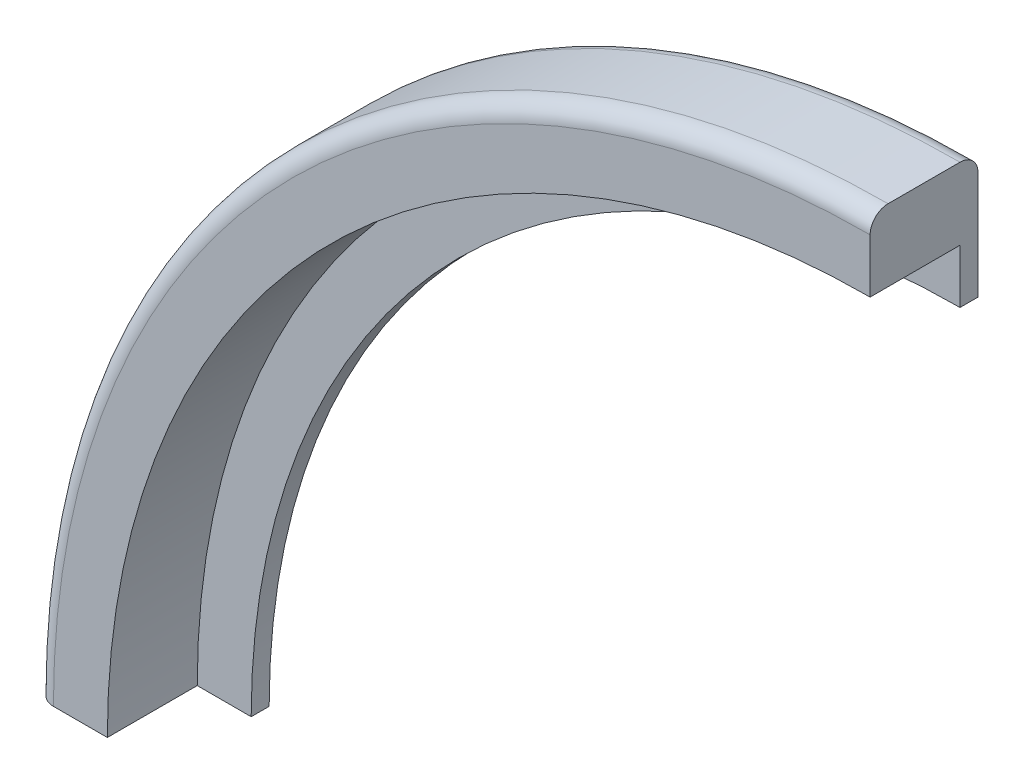
ISO-10303-21;
HEADER;
FILE_DESCRIPTION(('STEP AP214'),'2;1');
FILE_NAME('part.step','',(''),(''),'','','');
FILE_SCHEMA(('AUTOMOTIVE_DESIGN { 1 0 10303 214 1 1 1 1 }'));
ENDSEC;
DATA;
#1=APPLICATION_CONTEXT('core data for automotive mechanical design processes');
#2=APPLICATION_PROTOCOL_DEFINITION('international standard','automotive_design',2000,#1);
#3=PRODUCT_CONTEXT('',#1,'mechanical');
#4=PRODUCT('Part','Part','',(#3));
#5=PRODUCT_RELATED_PRODUCT_CATEGORY('part','',(#4));
#6=PRODUCT_DEFINITION_FORMATION('','',#4);
#7=PRODUCT_DEFINITION_CONTEXT('part definition',#1,'design');
#8=PRODUCT_DEFINITION('design','',#6,#7);
#9=PRODUCT_DEFINITION_SHAPE('','',#8);
#10=(LENGTH_UNIT() NAMED_UNIT(*) SI_UNIT(.MILLI.,.METRE.));
#11=(NAMED_UNIT(*) PLANE_ANGLE_UNIT() SI_UNIT($,.RADIAN.));
#12=(NAMED_UNIT(*) SI_UNIT($,.STERADIAN.) SOLID_ANGLE_UNIT());
#13=UNCERTAINTY_MEASURE_WITH_UNIT(LENGTH_MEASURE(1.E-05),#10,'distance_accuracy_value','');
#14=(GEOMETRIC_REPRESENTATION_CONTEXT(3) GLOBAL_UNCERTAINTY_ASSIGNED_CONTEXT((#13)) GLOBAL_UNIT_ASSIGNED_CONTEXT((#10,
#11,#12)) REPRESENTATION_CONTEXT('',''));
#15=CARTESIAN_POINT('',(0.,0.,0.));
#16=DIRECTION('',(0.,0.,1.));
#17=DIRECTION('',(1.,0.,0.));
#18=AXIS2_PLACEMENT_3D('',#15,#16,#17);
#19=CARTESIAN_POINT('',(-25.,-17.4264068711928,2.5));
#20=DIRECTION('',(0.,-1.,0.));
#21=DIRECTION('',(0.,0.,1.));
#22=AXIS2_PLACEMENT_3D('',#19,#20,#21);
#23=PLANE('',#22);
#24=DIRECTION('',(-1.,0.,0.));
#25=VECTOR('',#24,1.);
#26=CARTESIAN_POINT('',(-25.,-17.4264068711928,5.));
#27=LINE('',#26,#25);
#28=CARTESIAN_POINT('',(-25.,-17.4264068711928,5.));
#29=VERTEX_POINT('',#28);
#30=CARTESIAN_POINT('',(-28.,-17.4264068711928,5.));
#31=VERTEX_POINT('',#30);
#32=EDGE_CURVE('E152',#29,#31,#27,.T.);
#33=ORIENTED_EDGE('',*,*,#32,.T.);
#34=CARTESIAN_POINT('',(-28.,-17.4264068711928,4.));
#35=DIRECTION('',(0.,-1.,0.));
#36=DIRECTION('',(1.,0.,0.));
#37=AXIS2_PLACEMENT_3D('',#34,#35,#36);
#38=CIRCLE('',#37,1.);
#39=CARTESIAN_POINT('',(-29.,-17.4264068711928,4.));
#40=VERTEX_POINT('',#39);
#41=EDGE_CURVE('E162',#31,#40,#38,.T.);
#42=ORIENTED_EDGE('',*,*,#41,.T.);
#43=DIRECTION('',(0.,0.,1.));
#44=VECTOR('',#43,1.);
#45=CARTESIAN_POINT('',(-29.,-17.4264068711928,0.));
#46=LINE('',#45,#44);
#47=CARTESIAN_POINT('',(-29.,-17.4264068711928,0.));
#48=VERTEX_POINT('',#47);
#49=EDGE_CURVE('E136',#48,#40,#46,.T.);
#50=ORIENTED_EDGE('',*,*,#49,.F.);
#51=CARTESIAN_POINT('',(-28.,-17.4264068711928,0.));
#52=DIRECTION('',(0.,-1.,0.));
#53=DIRECTION('',(1.,0.,0.));
#54=AXIS2_PLACEMENT_3D('',#51,#52,#53);
#55=CIRCLE('',#54,1.);
#56=CARTESIAN_POINT('',(-28.,-17.4264068711928,-1.));
#57=VERTEX_POINT('',#56);
#58=EDGE_CURVE('E160',#48,#57,#55,.T.);
#59=ORIENTED_EDGE('',*,*,#58,.T.);
#60=DIRECTION('',(-1.,0.,0.));
#61=VECTOR('',#60,1.);
#62=CARTESIAN_POINT('',(-22.,-17.4264068711928,-1.));
#63=LINE('',#62,#61);
#64=CARTESIAN_POINT('',(-22.,-17.4264068711928,-1.));
#65=VERTEX_POINT('',#64);
#66=EDGE_CURVE('E126',#65,#57,#63,.T.);
#67=ORIENTED_EDGE('',*,*,#66,.F.);
#68=DIRECTION('',(0.,0.,1.));
#69=VECTOR('',#68,1.);
#70=CARTESIAN_POINT('',(-22.,-17.4264068711928,-1.));
#71=LINE('',#70,#69);
#72=CARTESIAN_POINT('',(-22.,-17.4264068711928,0.));
#73=VERTEX_POINT('',#72);
#74=EDGE_CURVE('E121',#65,#73,#71,.T.);
#75=ORIENTED_EDGE('',*,*,#74,.T.);
#76=DIRECTION('',(-1.,0.,0.));
#77=VECTOR('',#76,1.);
#78=CARTESIAN_POINT('',(-25.,-17.4264068711928,0.));
#79=LINE('',#78,#77);
#80=CARTESIAN_POINT('',(-25.,-17.4264068711928,0.));
#81=VERTEX_POINT('',#80);
#82=EDGE_CURVE('E109',#73,#81,#79,.T.);
#83=ORIENTED_EDGE('',*,*,#82,.T.);
#84=DIRECTION('',(0.,0.,1.));
#85=VECTOR('',#84,1.);
#86=CARTESIAN_POINT('',(-25.,-17.4264068711928,0.));
#87=LINE('',#86,#85);
#88=EDGE_CURVE('E141',#81,#29,#87,.T.);
#89=ORIENTED_EDGE('',*,*,#88,.T.);
#90=EDGE_LOOP('',(#33,#42,#50,#59,#67,#75,#83,#89));
#91=FACE_BOUND('',#90,.T.);
#92=ADVANCED_FACE('F35',(#91),#23,.T.);
#93=CARTESIAN_POINT('',(17.4264068711928,-17.4264068711928,5.));
#94=DIRECTION('',(0.,0.,-1.));
#95=DIRECTION('',(-1.,0.,0.));
#96=AXIS2_PLACEMENT_3D('',#93,#94,#95);
#97=PLANE('',#96);
#98=DIRECTION('',(0.,1.,0.));
#99=VECTOR('',#98,1.);
#100=CARTESIAN_POINT('',(17.4264068711928,25.,5.));
#101=LINE('',#100,#99);
#102=CARTESIAN_POINT('',(17.4264068711928,25.,5.));
#103=VERTEX_POINT('',#102);
#104=CARTESIAN_POINT('',(17.4264068711928,28.,5.));
#105=VERTEX_POINT('',#104);
#106=EDGE_CURVE('E138',#103,#105,#101,.T.);
#107=ORIENTED_EDGE('',*,*,#106,.T.);
#108=CARTESIAN_POINT('',(17.4264068711928,-17.4264068711928,5.));
#109=DIRECTION('',(0.,0.,-1.));
#110=DIRECTION('',(-1.,0.,0.));
#111=AXIS2_PLACEMENT_3D('',#108,#109,#110);
#112=CIRCLE('',#111,45.4264068711928);
#113=EDGE_CURVE('E155',#105,#31,#112,.F.);
#114=ORIENTED_EDGE('',*,*,#113,.T.);
#115=ORIENTED_EDGE('',*,*,#32,.F.);
#116=CARTESIAN_POINT('',(17.4264068711928,-17.4264068711928,5.));
#117=DIRECTION('',(0.,0.,1.));
#118=DIRECTION('',(1.,0.,0.));
#119=AXIS2_PLACEMENT_3D('',#116,#117,#118);
#120=CIRCLE('',#119,42.4264068711928);
#121=EDGE_CURVE('E120',#103,#29,#120,.T.);
#122=ORIENTED_EDGE('',*,*,#121,.F.);
#123=EDGE_LOOP('',(#107,#114,#115,#122));
#124=FACE_BOUND('',#123,.T.);
#125=ADVANCED_FACE('F172',(#124),#97,.F.);
#126=CARTESIAN_POINT('',(17.4264068711928,25.,2.5));
#127=DIRECTION('',(-1.,0.,0.));
#128=DIRECTION('',(0.,0.,1.));
#129=AXIS2_PLACEMENT_3D('',#126,#127,#128);
#130=PLANE('',#129);
#131=DIRECTION('',(0.,0.,1.));
#132=VECTOR('',#131,1.);
#133=CARTESIAN_POINT('',(17.4264068711928,29.,0.));
#134=LINE('',#133,#132);
#135=CARTESIAN_POINT('',(17.4264068711928,29.,0.));
#136=VERTEX_POINT('',#135);
#137=CARTESIAN_POINT('',(17.4264068711928,29.,4.));
#138=VERTEX_POINT('',#137);
#139=EDGE_CURVE('E139',#136,#138,#134,.T.);
#140=ORIENTED_EDGE('',*,*,#139,.T.);
#141=CARTESIAN_POINT('',(17.4264068711928,28.,4.));
#142=DIRECTION('',(-1.,0.,0.));
#143=DIRECTION('',(0.,-1.,0.));
#144=AXIS2_PLACEMENT_3D('',#141,#142,#143);
#145=CIRCLE('',#144,1.);
#146=EDGE_CURVE('E43',#138,#105,#145,.F.);
#147=ORIENTED_EDGE('',*,*,#146,.T.);
#148=ORIENTED_EDGE('',*,*,#106,.F.);
#149=DIRECTION('',(0.,0.,1.));
#150=VECTOR('',#149,1.);
#151=CARTESIAN_POINT('',(17.4264068711928,25.,0.));
#152=LINE('',#151,#150);
#153=CARTESIAN_POINT('',(17.4264068711928,25.,0.));
#154=VERTEX_POINT('',#153);
#155=EDGE_CURVE('E145',#154,#103,#152,.T.);
#156=ORIENTED_EDGE('',*,*,#155,.F.);
#157=DIRECTION('',(0.,-1.,0.));
#158=VECTOR('',#157,1.);
#159=CARTESIAN_POINT('',(17.4264068711928,29.,0.));
#160=LINE('',#159,#158);
#161=CARTESIAN_POINT('',(17.4264068711929,22.,0.));
#162=VERTEX_POINT('',#161);
#163=EDGE_CURVE('E116',#154,#162,#160,.T.);
#164=ORIENTED_EDGE('',*,*,#163,.T.);
#165=DIRECTION('',(0.,0.,1.));
#166=VECTOR('',#165,1.);
#167=CARTESIAN_POINT('',(17.4264068711929,22.,-1.));
#168=LINE('',#167,#166);
#169=CARTESIAN_POINT('',(17.4264068711929,22.,-1.));
#170=VERTEX_POINT('',#169);
#171=EDGE_CURVE('E112',#170,#162,#168,.T.);
#172=ORIENTED_EDGE('',*,*,#171,.F.);
#173=DIRECTION('',(0.,-1.,0.));
#174=VECTOR('',#173,1.);
#175=CARTESIAN_POINT('',(17.4264068711928,29.,-1.));
#176=LINE('',#175,#174);
#177=CARTESIAN_POINT('',(17.4264068711928,28.,-1.));
#178=VERTEX_POINT('',#177);
#179=EDGE_CURVE('E101',#178,#170,#176,.T.);
#180=ORIENTED_EDGE('',*,*,#179,.F.);
#181=CARTESIAN_POINT('',(17.4264068711928,28.,0.));
#182=DIRECTION('',(-1.,0.,0.));
#183=DIRECTION('',(0.,-1.,0.));
#184=AXIS2_PLACEMENT_3D('',#181,#182,#183);
#185=CIRCLE('',#184,1.);
#186=EDGE_CURVE('E50',#178,#136,#185,.F.);
#187=ORIENTED_EDGE('',*,*,#186,.T.);
#188=EDGE_LOOP('',(#140,#147,#148,#156,#164,#172,#180,#187));
#189=FACE_BOUND('',#188,.T.);
#190=ADVANCED_FACE('F113',(#189),#130,.F.);
#191=CARTESIAN_POINT('',(17.4264068711928,-17.4264068711928,0.));
#192=DIRECTION('',(0.,0.,1.));
#193=DIRECTION('',(1.,0.,0.));
#194=AXIS2_PLACEMENT_3D('',#191,#192,#193);
#195=CYLINDRICAL_SURFACE('',#194,46.4264068711928);
#196=ORIENTED_EDGE('',*,*,#49,.T.);
#197=CARTESIAN_POINT('',(17.4264068711928,-17.4264068711928,4.));
#198=DIRECTION('',(0.,0.,-1.));
#199=DIRECTION('',(-1.,0.,0.));
#200=AXIS2_PLACEMENT_3D('',#197,#198,#199);
#201=CIRCLE('',#200,46.4264068711928);
#202=EDGE_CURVE('E57',#40,#138,#201,.T.);
#203=ORIENTED_EDGE('',*,*,#202,.T.);
#204=ORIENTED_EDGE('',*,*,#139,.F.);
#205=CARTESIAN_POINT('',(17.4264068711928,-17.4264068711928,0.));
#206=DIRECTION('',(0.,0.,-1.));
#207=DIRECTION('',(-1.,0.,0.));
#208=AXIS2_PLACEMENT_3D('',#205,#206,#207);
#209=CIRCLE('',#208,46.4264068711928);
#210=EDGE_CURVE('E164',#136,#48,#209,.F.);
#211=ORIENTED_EDGE('',*,*,#210,.T.);
#212=EDGE_LOOP('',(#196,#203,#204,#211));
#213=FACE_BOUND('',#212,.T.);
#214=ADVANCED_FACE('F177',(#213),#195,.T.);
#215=CARTESIAN_POINT('',(17.4264068711928,-17.4264068711928,0.));
#216=DIRECTION('',(0.,0.,1.));
#217=DIRECTION('',(1.,0.,0.));
#218=AXIS2_PLACEMENT_3D('',#215,#216,#217);
#219=CYLINDRICAL_SURFACE('',#218,42.4264068711928);
#220=ORIENTED_EDGE('',*,*,#121,.T.);
#221=ORIENTED_EDGE('',*,*,#88,.F.);
#222=CARTESIAN_POINT('',(17.4264068711928,-17.4264068711928,0.));
#223=DIRECTION('',(0.,0.,1.));
#224=DIRECTION('',(1.,0.,0.));
#225=AXIS2_PLACEMENT_3D('',#222,#223,#224);
#226=CIRCLE('',#225,42.4264068711928);
#227=EDGE_CURVE('E142',#154,#81,#226,.T.);
#228=ORIENTED_EDGE('',*,*,#227,.F.);
#229=ORIENTED_EDGE('',*,*,#155,.T.);
#230=EDGE_LOOP('',(#220,#221,#228,#229));
#231=FACE_BOUND('',#230,.T.);
#232=ADVANCED_FACE('F181',(#231),#219,.F.);
#233=CARTESIAN_POINT('',(17.4264068711928,-17.4264068711928,0.));
#234=DIRECTION('',(0.,0.,-1.));
#235=DIRECTION('',(-1.,0.,0.));
#236=AXIS2_PLACEMENT_3D('',#233,#234,#235);
#237=PLANE('',#236);
#238=ORIENTED_EDGE('',*,*,#163,.F.);
#239=ORIENTED_EDGE('',*,*,#227,.T.);
#240=ORIENTED_EDGE('',*,*,#82,.F.);
#241=CARTESIAN_POINT('',(17.4264068711928,-17.4264068711928,0.));
#242=DIRECTION('',(0.,0.,1.));
#243=DIRECTION('',(-1.,0.,0.));
#244=AXIS2_PLACEMENT_3D('',#241,#242,#243);
#245=CIRCLE('',#244,39.4264068711928);
#246=EDGE_CURVE('E131',#162,#73,#245,.T.);
#247=ORIENTED_EDGE('',*,*,#246,.F.);
#248=EDGE_LOOP('',(#238,#239,#240,#247));
#249=FACE_BOUND('',#248,.T.);
#250=ADVANCED_FACE('F179',(#249),#237,.F.);
#251=CARTESIAN_POINT('',(17.4264068711928,-17.4264068711928,-1.));
#252=DIRECTION('',(0.,0.,1.));
#253=DIRECTION('',(1.,0.,0.));
#254=AXIS2_PLACEMENT_3D('',#251,#252,#253);
#255=CYLINDRICAL_SURFACE('',#254,39.4264068711928);
#256=ORIENTED_EDGE('',*,*,#246,.T.);
#257=ORIENTED_EDGE('',*,*,#74,.F.);
#258=CARTESIAN_POINT('',(17.4264068711928,-17.4264068711928,-1.));
#259=DIRECTION('',(0.,0.,1.));
#260=DIRECTION('',(-1.,0.,0.));
#261=AXIS2_PLACEMENT_3D('',#258,#259,#260);
#262=CIRCLE('',#261,39.4264068711928);
#263=EDGE_CURVE('E106',#170,#65,#262,.T.);
#264=ORIENTED_EDGE('',*,*,#263,.F.);
#265=ORIENTED_EDGE('',*,*,#171,.T.);
#266=EDGE_LOOP('',(#256,#257,#264,#265));
#267=FACE_BOUND('',#266,.T.);
#268=ADVANCED_FACE('F123',(#267),#255,.F.);
#269=CARTESIAN_POINT('',(17.4264068711928,-17.4264068711928,-1.));
#270=DIRECTION('',(0.,0.,-1.));
#271=DIRECTION('',(-1.,0.,0.));
#272=AXIS2_PLACEMENT_3D('',#269,#270,#271);
#273=PLANE('',#272);
#274=ORIENTED_EDGE('',*,*,#66,.T.);
#275=CARTESIAN_POINT('',(17.4264068711928,-17.4264068711928,-1.));
#276=DIRECTION('',(0.,0.,-1.));
#277=DIRECTION('',(-1.,0.,0.));
#278=AXIS2_PLACEMENT_3D('',#275,#276,#277);
#279=CIRCLE('',#278,45.4264068711928);
#280=EDGE_CURVE('E11',#57,#178,#279,.T.);
#281=ORIENTED_EDGE('',*,*,#280,.T.);
#282=ORIENTED_EDGE('',*,*,#179,.T.);
#283=ORIENTED_EDGE('',*,*,#263,.T.);
#284=EDGE_LOOP('',(#274,#281,#282,#283));
#285=FACE_BOUND('',#284,.T.);
#286=ADVANCED_FACE('F104',(#285),#273,.T.);
#287=CARTESIAN_POINT('',(17.4264068711928,-17.4264068711928,4.));
#288=DIRECTION('',(0.,0.,-1.));
#289=DIRECTION('',(-1.,0.,0.));
#290=AXIS2_PLACEMENT_3D('',#287,#288,#289);
#291=TOROIDAL_SURFACE('',#290,45.4264068711928,1.);
#292=ORIENTED_EDGE('',*,*,#146,.F.);
#293=ORIENTED_EDGE('',*,*,#202,.F.);
#294=ORIENTED_EDGE('',*,*,#41,.F.);
#295=ORIENTED_EDGE('',*,*,#113,.F.);
#296=EDGE_LOOP('',(#292,#293,#294,#295));
#297=FACE_BOUND('',#296,.T.);
#298=ADVANCED_FACE('F173',(#297),#291,.T.);
#299=CARTESIAN_POINT('',(17.4264068711928,-17.4264068711928,0.));
#300=DIRECTION('',(0.,0.,-1.));
#301=DIRECTION('',(-1.,0.,0.));
#302=AXIS2_PLACEMENT_3D('',#299,#300,#301);
#303=TOROIDAL_SURFACE('',#302,45.4264068711928,1.);
#304=ORIENTED_EDGE('',*,*,#58,.F.);
#305=ORIENTED_EDGE('',*,*,#210,.F.);
#306=ORIENTED_EDGE('',*,*,#186,.F.);
#307=ORIENTED_EDGE('',*,*,#280,.F.);
#308=EDGE_LOOP('',(#304,#305,#306,#307));
#309=FACE_BOUND('',#308,.T.);
#310=ADVANCED_FACE('F37',(#309),#303,.T.);
#311=CLOSED_SHELL('',(#92,#125,#190,#214,#232,#250,#268,#286,#298,#310));
#312=MANIFOLD_SOLID_BREP('B2',#311);
#313=ADVANCED_BREP_SHAPE_REPRESENTATION('',(#18,#312),#14);
#314=SHAPE_DEFINITION_REPRESENTATION(#9,#313);
ENDSEC;
END-ISO-10303-21;
